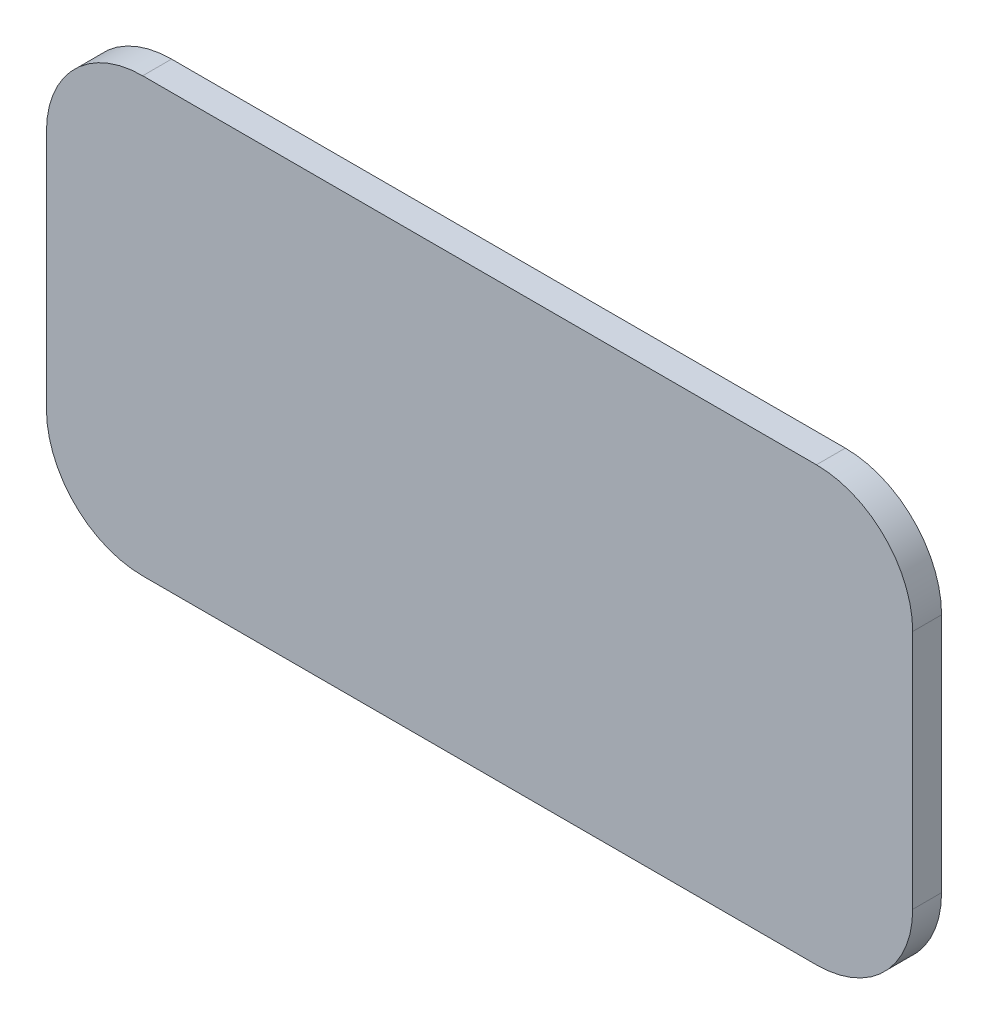
ISO-10303-21;
HEADER;
FILE_DESCRIPTION(('STEP AP214'),'2;1');
FILE_NAME('part.step','',(''),(''),'','','');
FILE_SCHEMA(('AUTOMOTIVE_DESIGN { 1 0 10303 214 1 1 1 1 }'));
ENDSEC;
DATA;
#1=APPLICATION_CONTEXT('core data for automotive mechanical design processes');
#2=APPLICATION_PROTOCOL_DEFINITION('international standard','automotive_design',2000,#1);
#3=PRODUCT_CONTEXT('',#1,'mechanical');
#4=PRODUCT('Part','Part','',(#3));
#5=PRODUCT_RELATED_PRODUCT_CATEGORY('part','',(#4));
#6=PRODUCT_DEFINITION_FORMATION('','',#4);
#7=PRODUCT_DEFINITION_CONTEXT('part definition',#1,'design');
#8=PRODUCT_DEFINITION('design','',#6,#7);
#9=PRODUCT_DEFINITION_SHAPE('','',#8);
#10=(LENGTH_UNIT() NAMED_UNIT(*) SI_UNIT(.MILLI.,.METRE.));
#11=(NAMED_UNIT(*) PLANE_ANGLE_UNIT() SI_UNIT($,.RADIAN.));
#12=(NAMED_UNIT(*) SI_UNIT($,.STERADIAN.) SOLID_ANGLE_UNIT());
#13=UNCERTAINTY_MEASURE_WITH_UNIT(LENGTH_MEASURE(1.E-05),#10,'distance_accuracy_value','');
#14=(GEOMETRIC_REPRESENTATION_CONTEXT(3) GLOBAL_UNCERTAINTY_ASSIGNED_CONTEXT((#13)) GLOBAL_UNIT_ASSIGNED_CONTEXT((#10,
#11,#12)) REPRESENTATION_CONTEXT('',''));
#15=CARTESIAN_POINT('',(0.,0.,0.));
#16=DIRECTION('',(0.,0.,1.));
#17=DIRECTION('',(1.,0.,0.));
#18=AXIS2_PLACEMENT_3D('',#15,#16,#17);
#19=CARTESIAN_POINT('',(45.,22.5,3.));
#20=DIRECTION('',(-1.,0.,0.));
#21=DIRECTION('',(0.,0.,1.));
#22=AXIS2_PLACEMENT_3D('',#19,#20,#21);
#23=PLANE('',#22);
#24=DIRECTION('',(0.,1.,0.));
#25=VECTOR('',#24,1.);
#26=CARTESIAN_POINT('',(45.,22.5,3.));
#27=LINE('',#26,#25);
#28=CARTESIAN_POINT('',(45.,-12.5,3.));
#29=VERTEX_POINT('',#28);
#30=CARTESIAN_POINT('',(45.,12.5,3.));
#31=VERTEX_POINT('',#30);
#32=EDGE_CURVE('E126',#29,#31,#27,.T.);
#33=ORIENTED_EDGE('',*,*,#32,.F.);
#34=DIRECTION('',(0.,0.,-1.));
#35=VECTOR('',#34,1.);
#36=CARTESIAN_POINT('',(45.,-12.5,3.));
#37=LINE('',#36,#35);
#38=CARTESIAN_POINT('',(45.,-12.5,0.));
#39=VERTEX_POINT('',#38);
#40=EDGE_CURVE('E11',#29,#39,#37,.T.);
#41=ORIENTED_EDGE('',*,*,#40,.T.);
#42=DIRECTION('',(0.,1.,0.));
#43=VECTOR('',#42,1.);
#44=CARTESIAN_POINT('',(45.,22.5,0.));
#45=LINE('',#44,#43);
#46=CARTESIAN_POINT('',(45.,12.5,0.));
#47=VERTEX_POINT('',#46);
#48=EDGE_CURVE('E157',#39,#47,#45,.T.);
#49=ORIENTED_EDGE('',*,*,#48,.T.);
#50=DIRECTION('',(0.,0.,-1.));
#51=VECTOR('',#50,1.);
#52=CARTESIAN_POINT('',(45.,12.5,3.));
#53=LINE('',#52,#51);
#54=EDGE_CURVE('E40',#47,#31,#53,.F.);
#55=ORIENTED_EDGE('',*,*,#54,.T.);
#56=EDGE_LOOP('',(#33,#41,#49,#55));
#57=FACE_BOUND('',#56,.T.);
#58=ADVANCED_FACE('F32',(#57),#23,.F.);
#59=CARTESIAN_POINT('',(-45.,22.5,3.));
#60=DIRECTION('',(0.,-1.,0.));
#61=DIRECTION('',(0.,0.,-1.));
#62=AXIS2_PLACEMENT_3D('',#59,#60,#61);
#63=PLANE('',#62);
#64=DIRECTION('',(-1.,0.,0.));
#65=VECTOR('',#64,1.);
#66=CARTESIAN_POINT('',(-45.,22.5,0.));
#67=LINE('',#66,#65);
#68=CARTESIAN_POINT('',(35.,22.5,0.));
#69=VERTEX_POINT('',#68);
#70=CARTESIAN_POINT('',(-35.,22.5,0.));
#71=VERTEX_POINT('',#70);
#72=EDGE_CURVE('E131',#69,#71,#67,.T.);
#73=ORIENTED_EDGE('',*,*,#72,.T.);
#74=DIRECTION('',(0.,0.,-1.));
#75=VECTOR('',#74,1.);
#76=CARTESIAN_POINT('',(-35.,22.5,3.));
#77=LINE('',#76,#75);
#78=CARTESIAN_POINT('',(-35.,22.5,3.));
#79=VERTEX_POINT('',#78);
#80=EDGE_CURVE('E47',#71,#79,#77,.F.);
#81=ORIENTED_EDGE('',*,*,#80,.T.);
#82=DIRECTION('',(-1.,0.,0.));
#83=VECTOR('',#82,1.);
#84=CARTESIAN_POINT('',(-45.,22.5,3.));
#85=LINE('',#84,#83);
#86=CARTESIAN_POINT('',(35.,22.5,3.));
#87=VERTEX_POINT('',#86);
#88=EDGE_CURVE('E129',#87,#79,#85,.T.);
#89=ORIENTED_EDGE('',*,*,#88,.F.);
#90=DIRECTION('',(0.,0.,-1.));
#91=VECTOR('',#90,1.);
#92=CARTESIAN_POINT('',(35.,22.5,3.));
#93=LINE('',#92,#91);
#94=EDGE_CURVE('E149',#87,#69,#93,.T.);
#95=ORIENTED_EDGE('',*,*,#94,.T.);
#96=EDGE_LOOP('',(#73,#81,#89,#95));
#97=FACE_BOUND('',#96,.T.);
#98=ADVANCED_FACE('F164',(#97),#63,.F.);
#99=CARTESIAN_POINT('',(-45.,22.5,3.));
#100=DIRECTION('',(1.,0.,0.));
#101=DIRECTION('',(0.,0.,-1.));
#102=AXIS2_PLACEMENT_3D('',#99,#100,#101);
#103=PLANE('',#102);
#104=DIRECTION('',(0.,-1.,0.));
#105=VECTOR('',#104,1.);
#106=CARTESIAN_POINT('',(-45.,22.5,0.));
#107=LINE('',#106,#105);
#108=CARTESIAN_POINT('',(-45.,12.5,0.));
#109=VERTEX_POINT('',#108);
#110=CARTESIAN_POINT('',(-45.,-12.5,0.));
#111=VERTEX_POINT('',#110);
#112=EDGE_CURVE('E127',#109,#111,#107,.T.);
#113=ORIENTED_EDGE('',*,*,#112,.T.);
#114=DIRECTION('',(0.,0.,-1.));
#115=VECTOR('',#114,1.);
#116=CARTESIAN_POINT('',(-45.,-12.5,3.));
#117=LINE('',#116,#115);
#118=CARTESIAN_POINT('',(-45.,-12.5,3.));
#119=VERTEX_POINT('',#118);
#120=EDGE_CURVE('E104',#111,#119,#117,.F.);
#121=ORIENTED_EDGE('',*,*,#120,.T.);
#122=DIRECTION('',(0.,-1.,0.));
#123=VECTOR('',#122,1.);
#124=CARTESIAN_POINT('',(-45.,22.5,3.));
#125=LINE('',#124,#123);
#126=CARTESIAN_POINT('',(-45.,12.5,3.));
#127=VERTEX_POINT('',#126);
#128=EDGE_CURVE('E168',#127,#119,#125,.T.);
#129=ORIENTED_EDGE('',*,*,#128,.F.);
#130=DIRECTION('',(0.,0.,-1.));
#131=VECTOR('',#130,1.);
#132=CARTESIAN_POINT('',(-45.,12.5,3.));
#133=LINE('',#132,#131);
#134=EDGE_CURVE('E109',#127,#109,#133,.T.);
#135=ORIENTED_EDGE('',*,*,#134,.T.);
#136=EDGE_LOOP('',(#113,#121,#129,#135));
#137=FACE_BOUND('',#136,.T.);
#138=ADVANCED_FACE('F176',(#137),#103,.F.);
#139=CARTESIAN_POINT('',(-45.,-22.5,3.));
#140=DIRECTION('',(0.,1.,0.));
#141=DIRECTION('',(0.,0.,1.));
#142=AXIS2_PLACEMENT_3D('',#139,#140,#141);
#143=PLANE('',#142);
#144=DIRECTION('',(1.,0.,0.));
#145=VECTOR('',#144,1.);
#146=CARTESIAN_POINT('',(-45.,-22.5,3.));
#147=LINE('',#146,#145);
#148=CARTESIAN_POINT('',(-35.,-22.5,3.));
#149=VERTEX_POINT('',#148);
#150=CARTESIAN_POINT('',(35.,-22.5,3.));
#151=VERTEX_POINT('',#150);
#152=EDGE_CURVE('E119',#149,#151,#147,.T.);
#153=ORIENTED_EDGE('',*,*,#152,.F.);
#154=DIRECTION('',(0.,0.,-1.));
#155=VECTOR('',#154,1.);
#156=CARTESIAN_POINT('',(-35.,-22.5,3.));
#157=LINE('',#156,#155);
#158=CARTESIAN_POINT('',(-35.,-22.5,0.));
#159=VERTEX_POINT('',#158);
#160=EDGE_CURVE('E103',#149,#159,#157,.T.);
#161=ORIENTED_EDGE('',*,*,#160,.T.);
#162=DIRECTION('',(1.,0.,0.));
#163=VECTOR('',#162,1.);
#164=CARTESIAN_POINT('',(-45.,-22.5,0.));
#165=LINE('',#164,#163);
#166=CARTESIAN_POINT('',(35.,-22.5,0.));
#167=VERTEX_POINT('',#166);
#168=EDGE_CURVE('E116',#159,#167,#165,.T.);
#169=ORIENTED_EDGE('',*,*,#168,.T.);
#170=DIRECTION('',(0.,0.,-1.));
#171=VECTOR('',#170,1.);
#172=CARTESIAN_POINT('',(35.,-22.5,3.));
#173=LINE('',#172,#171);
#174=EDGE_CURVE('E121',#167,#151,#173,.F.);
#175=ORIENTED_EDGE('',*,*,#174,.T.);
#176=EDGE_LOOP('',(#153,#161,#169,#175));
#177=FACE_BOUND('',#176,.T.);
#178=ADVANCED_FACE('F115',(#177),#143,.F.);
#179=CARTESIAN_POINT('',(0.,0.,3.));
#180=DIRECTION('',(0.,0.,1.));
#181=DIRECTION('',(1.,0.,0.));
#182=AXIS2_PLACEMENT_3D('',#179,#180,#181);
#183=PLANE('',#182);
#184=ORIENTED_EDGE('',*,*,#128,.T.);
#185=CARTESIAN_POINT('',(-35.,-12.5,3.));
#186=DIRECTION('',(0.,0.,1.));
#187=DIRECTION('',(1.,0.,0.));
#188=AXIS2_PLACEMENT_3D('',#185,#186,#187);
#189=CIRCLE('',#188,10.);
#190=EDGE_CURVE('E147',#119,#149,#189,.T.);
#191=ORIENTED_EDGE('',*,*,#190,.T.);
#192=ORIENTED_EDGE('',*,*,#152,.T.);
#193=CARTESIAN_POINT('',(35.,-12.5,3.));
#194=DIRECTION('',(0.,0.,1.));
#195=DIRECTION('',(1.,0.,0.));
#196=AXIS2_PLACEMENT_3D('',#193,#194,#195);
#197=CIRCLE('',#196,10.);
#198=EDGE_CURVE('E143',#151,#29,#197,.T.);
#199=ORIENTED_EDGE('',*,*,#198,.T.);
#200=ORIENTED_EDGE('',*,*,#32,.T.);
#201=CARTESIAN_POINT('',(35.,12.5,3.));
#202=DIRECTION('',(0.,0.,1.));
#203=DIRECTION('',(1.,0.,0.));
#204=AXIS2_PLACEMENT_3D('',#201,#202,#203);
#205=CIRCLE('',#204,10.);
#206=EDGE_CURVE('E54',#31,#87,#205,.T.);
#207=ORIENTED_EDGE('',*,*,#206,.T.);
#208=ORIENTED_EDGE('',*,*,#88,.T.);
#209=CARTESIAN_POINT('',(-35.,12.5,3.));
#210=DIRECTION('',(0.,0.,1.));
#211=DIRECTION('',(1.,0.,0.));
#212=AXIS2_PLACEMENT_3D('',#209,#210,#211);
#213=CIRCLE('',#212,10.);
#214=EDGE_CURVE('E145',#79,#127,#213,.T.);
#215=ORIENTED_EDGE('',*,*,#214,.T.);
#216=EDGE_LOOP('',(#184,#191,#192,#199,#200,#207,#208,#215));
#217=FACE_BOUND('',#216,.T.);
#218=ADVANCED_FACE('F160',(#217),#183,.T.);
#219=CARTESIAN_POINT('',(0.,0.,0.));
#220=DIRECTION('',(0.,0.,1.));
#221=DIRECTION('',(1.,0.,0.));
#222=AXIS2_PLACEMENT_3D('',#219,#220,#221);
#223=PLANE('',#222);
#224=ORIENTED_EDGE('',*,*,#168,.F.);
#225=CARTESIAN_POINT('',(-35.,-12.5,0.));
#226=DIRECTION('',(0.,0.,1.));
#227=DIRECTION('',(1.,0.,0.));
#228=AXIS2_PLACEMENT_3D('',#225,#226,#227);
#229=CIRCLE('',#228,10.);
#230=EDGE_CURVE('E99',#159,#111,#229,.F.);
#231=ORIENTED_EDGE('',*,*,#230,.T.);
#232=ORIENTED_EDGE('',*,*,#112,.F.);
#233=CARTESIAN_POINT('',(-35.,12.5,0.));
#234=DIRECTION('',(0.,0.,1.));
#235=DIRECTION('',(1.,0.,0.));
#236=AXIS2_PLACEMENT_3D('',#233,#234,#235);
#237=CIRCLE('',#236,10.);
#238=EDGE_CURVE('E110',#109,#71,#237,.F.);
#239=ORIENTED_EDGE('',*,*,#238,.T.);
#240=ORIENTED_EDGE('',*,*,#72,.F.);
#241=CARTESIAN_POINT('',(35.,12.5,0.));
#242=DIRECTION('',(0.,0.,1.));
#243=DIRECTION('',(1.,0.,0.));
#244=AXIS2_PLACEMENT_3D('',#241,#242,#243);
#245=CIRCLE('',#244,10.);
#246=EDGE_CURVE('E120',#69,#47,#245,.F.);
#247=ORIENTED_EDGE('',*,*,#246,.T.);
#248=ORIENTED_EDGE('',*,*,#48,.F.);
#249=CARTESIAN_POINT('',(35.,-12.5,0.));
#250=DIRECTION('',(0.,0.,1.));
#251=DIRECTION('',(1.,0.,0.));
#252=AXIS2_PLACEMENT_3D('',#249,#250,#251);
#253=CIRCLE('',#252,10.);
#254=EDGE_CURVE('E125',#39,#167,#253,.F.);
#255=ORIENTED_EDGE('',*,*,#254,.T.);
#256=EDGE_LOOP('',(#224,#231,#232,#239,#240,#247,#248,#255));
#257=FACE_BOUND('',#256,.T.);
#258=ADVANCED_FACE('F123',(#257),#223,.F.);
#259=CARTESIAN_POINT('',(-35.,-12.5,3.));
#260=DIRECTION('',(0.,0.,-1.));
#261=DIRECTION('',(-1.,0.,0.));
#262=AXIS2_PLACEMENT_3D('',#259,#260,#261);
#263=CYLINDRICAL_SURFACE('',#262,10.);
#264=ORIENTED_EDGE('',*,*,#190,.F.);
#265=ORIENTED_EDGE('',*,*,#120,.F.);
#266=ORIENTED_EDGE('',*,*,#230,.F.);
#267=ORIENTED_EDGE('',*,*,#160,.F.);
#268=EDGE_LOOP('',(#264,#265,#266,#267));
#269=FACE_BOUND('',#268,.T.);
#270=ADVANCED_FACE('F102',(#269),#263,.T.);
#271=CARTESIAN_POINT('',(-35.,12.5,3.));
#272=DIRECTION('',(0.,0.,-1.));
#273=DIRECTION('',(-1.,0.,0.));
#274=AXIS2_PLACEMENT_3D('',#271,#272,#273);
#275=CYLINDRICAL_SURFACE('',#274,10.);
#276=ORIENTED_EDGE('',*,*,#214,.F.);
#277=ORIENTED_EDGE('',*,*,#80,.F.);
#278=ORIENTED_EDGE('',*,*,#238,.F.);
#279=ORIENTED_EDGE('',*,*,#134,.F.);
#280=EDGE_LOOP('',(#276,#277,#278,#279));
#281=FACE_BOUND('',#280,.T.);
#282=ADVANCED_FACE('F174',(#281),#275,.T.);
#283=CARTESIAN_POINT('',(35.,-12.5,3.));
#284=DIRECTION('',(0.,0.,-1.));
#285=DIRECTION('',(-1.,0.,0.));
#286=AXIS2_PLACEMENT_3D('',#283,#284,#285);
#287=CYLINDRICAL_SURFACE('',#286,10.);
#288=ORIENTED_EDGE('',*,*,#198,.F.);
#289=ORIENTED_EDGE('',*,*,#174,.F.);
#290=ORIENTED_EDGE('',*,*,#254,.F.);
#291=ORIENTED_EDGE('',*,*,#40,.F.);
#292=EDGE_LOOP('',(#288,#289,#290,#291));
#293=FACE_BOUND('',#292,.T.);
#294=ADVANCED_FACE('F178',(#293),#287,.T.);
#295=CARTESIAN_POINT('',(35.,12.5,3.));
#296=DIRECTION('',(0.,0.,-1.));
#297=DIRECTION('',(-1.,0.,0.));
#298=AXIS2_PLACEMENT_3D('',#295,#296,#297);
#299=CYLINDRICAL_SURFACE('',#298,10.);
#300=ORIENTED_EDGE('',*,*,#206,.F.);
#301=ORIENTED_EDGE('',*,*,#54,.F.);
#302=ORIENTED_EDGE('',*,*,#246,.F.);
#303=ORIENTED_EDGE('',*,*,#94,.F.);
#304=EDGE_LOOP('',(#300,#301,#302,#303));
#305=FACE_BOUND('',#304,.T.);
#306=ADVANCED_FACE('F34',(#305),#299,.T.);
#307=CLOSED_SHELL('',(#58,#98,#138,#178,#218,#258,#270,#282,#294,#306));
#308=MANIFOLD_SOLID_BREP('B2',#307);
#309=ADVANCED_BREP_SHAPE_REPRESENTATION('',(#18,#308),#14);
#310=SHAPE_DEFINITION_REPRESENTATION(#9,#309);
ENDSEC;
END-ISO-10303-21;
